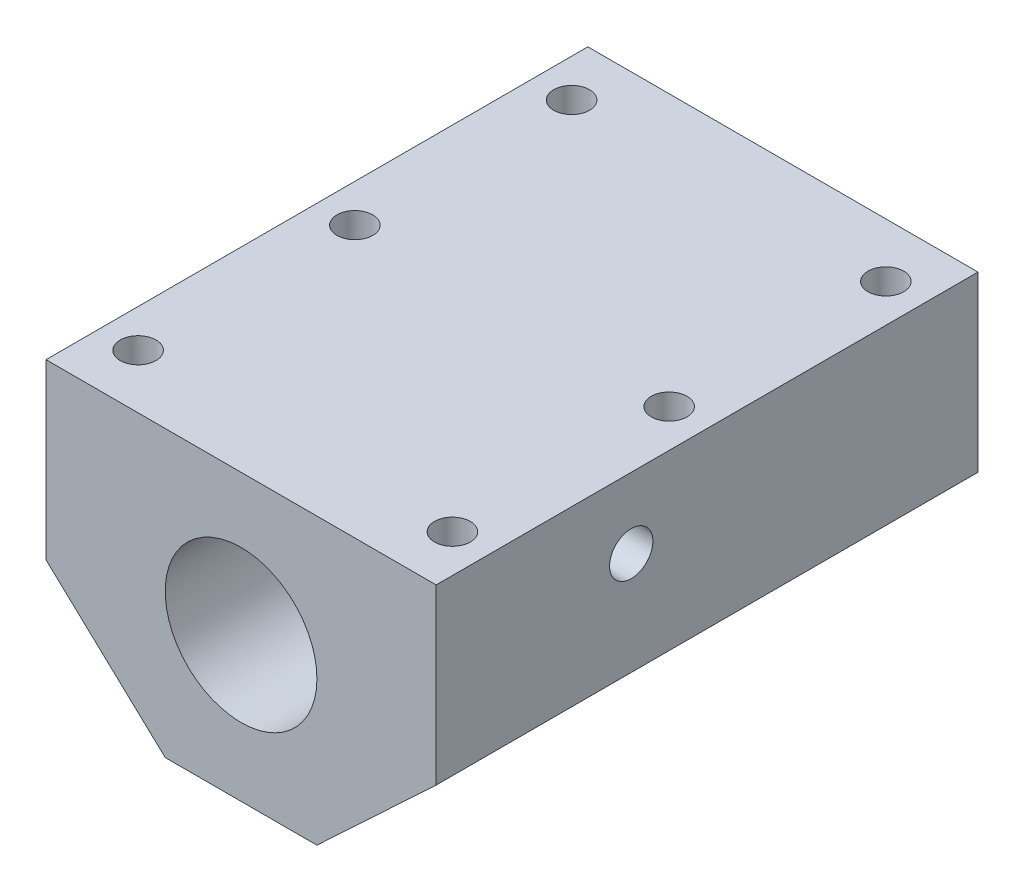
ISO-10303-21;
HEADER;
FILE_DESCRIPTION(('STEP AP214'),'2;1');
FILE_NAME('part.step','',(''),(''),'','','');
FILE_SCHEMA(('AUTOMOTIVE_DESIGN { 1 0 10303 214 1 1 1 1 }'));
ENDSEC;
DATA;
#1=APPLICATION_CONTEXT('core data for automotive mechanical design processes');
#2=APPLICATION_PROTOCOL_DEFINITION('international standard','automotive_design',2000,#1);
#3=PRODUCT_CONTEXT('',#1,'mechanical');
#4=PRODUCT('Part','Part','',(#3));
#5=PRODUCT_RELATED_PRODUCT_CATEGORY('part','',(#4));
#6=PRODUCT_DEFINITION_FORMATION('','',#4);
#7=PRODUCT_DEFINITION_CONTEXT('part definition',#1,'design');
#8=PRODUCT_DEFINITION('design','',#6,#7);
#9=PRODUCT_DEFINITION_SHAPE('','',#8);
#10=(LENGTH_UNIT() NAMED_UNIT(*) SI_UNIT(.MILLI.,.METRE.));
#11=(NAMED_UNIT(*) PLANE_ANGLE_UNIT() SI_UNIT($,.RADIAN.));
#12=(NAMED_UNIT(*) SI_UNIT($,.STERADIAN.) SOLID_ANGLE_UNIT());
#13=UNCERTAINTY_MEASURE_WITH_UNIT(LENGTH_MEASURE(1.E-05),#10,'distance_accuracy_value','');
#14=(GEOMETRIC_REPRESENTATION_CONTEXT(3) GLOBAL_UNCERTAINTY_ASSIGNED_CONTEXT((#13)) GLOBAL_UNIT_ASSIGNED_CONTEXT((#10,
#11,#12)) REPRESENTATION_CONTEXT('',''));
#15=CARTESIAN_POINT('',(0.,0.,0.));
#16=DIRECTION('',(0.,0.,1.));
#17=DIRECTION('',(1.,0.,0.));
#18=AXIS2_PLACEMENT_3D('',#15,#16,#17);
#19=CARTESIAN_POINT('',(18.,6.5,32.));
#20=DIRECTION('',(1.,0.,0.));
#21=DIRECTION('',(0.,0.,-1.));
#22=AXIS2_PLACEMENT_3D('',#19,#20,#21);
#23=CYLINDRICAL_SURFACE('',#22,1.49999999999999);
#24=CARTESIAN_POINT('',(11.6322990396012,5.70347429671537,30.7289583783342));
#25=CARTESIAN_POINT('',(11.7134036836361,5.76023466684744,30.6933373257331));
#26=CARTESIAN_POINT('',(11.7910631729503,5.82362191969331,30.6589809638108));
#27=CARTESIAN_POINT('',(11.9380315876861,5.96355612535442,30.5971052209684));
#28=CARTESIAN_POINT('',(12.0072576664742,6.04021810527068,30.5696512267885));
#29=CARTESIAN_POINT('',(12.1187673995393,6.18528871563461,30.5319699750056));
#30=CARTESIAN_POINT('',(12.1634964221333,6.2511168142296,30.5191699684488));
#31=CARTESIAN_POINT('',(12.2450530551135,6.3883294002631,30.5025753262953));
#32=CARTESIAN_POINT('',(12.2819078507789,6.45969357187347,30.4987492367373));
#33=CARTESIAN_POINT('',(12.3469819115841,6.60687055979773,30.501989272479));
#34=CARTESIAN_POINT('',(12.3751209392542,6.6827174741155,30.5091531864094));
#35=CARTESIAN_POINT('',(12.4215901872934,6.83528396911386,30.535906120018));
#36=CARTESIAN_POINT('',(12.4399194839487,6.91200363128061,30.5554963094123));
#37=CARTESIAN_POINT('',(12.4653966592906,7.05345016340296,30.6040825380621));
#38=CARTESIAN_POINT('',(12.4736454053363,7.11848849159615,30.6316191763977));
#39=CARTESIAN_POINT('',(12.4837722413398,7.24439439245408,30.6958258205429));
#40=CARTESIAN_POINT('',(12.4856503897941,7.30526200341046,30.7324957424847));
#41=CARTESIAN_POINT('',(12.4844058857708,7.42175663923835,30.814463841543));
#42=CARTESIAN_POINT('',(12.4812294618118,7.47732055895023,30.8598502171489));
#43=CARTESIAN_POINT('',(12.471443621996,7.58126096666866,30.9578935862006));
#44=CARTESIAN_POINT('',(12.4648326072427,7.62963409366266,31.0105539575023));
#45=CARTESIAN_POINT('',(12.4490238880115,7.72349710321992,31.1285746456295));
#46=CARTESIAN_POINT('',(12.4396143116599,7.76799118127184,31.1946998858437));
#47=CARTESIAN_POINT('',(12.4209626176597,7.84598795129315,31.3331883323169));
#48=CARTESIAN_POINT('',(12.4117205725327,7.87948598576761,31.4055541655033));
#49=CARTESIAN_POINT('',(12.3949258972307,7.93649816462685,31.5599119373404));
#50=CARTESIAN_POINT('',(12.3875265724169,7.9591998051582,31.6422239921759));
#51=CARTESIAN_POINT('',(12.377147728257,7.99032121449143,31.8097561522014));
#52=CARTESIAN_POINT('',(12.3741657931196,7.99874878988569,31.8949746418068));
#53=CARTESIAN_POINT('',(12.3733997975059,8.0009413690067,32.0617385185441));
#54=CARTESIAN_POINT('',(12.3753857906687,7.9953549906227,32.1432749255414));
#55=CARTESIAN_POINT('',(12.3835994081308,7.97109163219571,32.3041560022858));
#56=CARTESIAN_POINT('',(12.3898279083613,7.9524119488145,32.3835002158999));
#57=CARTESIAN_POINT('',(12.4050168059968,7.90280998810426,32.5372104262713));
#58=CARTESIAN_POINT('',(12.413953647251,7.87199261349013,32.6116128580504));
#59=CARTESIAN_POINT('',(12.4325664615661,7.79891325152446,32.7544990933768));
#60=CARTESIAN_POINT('',(12.4422427935951,7.7566456802889,32.8229799876335));
#61=CARTESIAN_POINT('',(12.4604905193285,7.65897294470026,32.9560100752913));
#62=CARTESIAN_POINT('',(12.4689725125861,7.60297559143576,33.0201392621325));
#63=CARTESIAN_POINT('',(12.4812621583888,7.48065493021329,33.1382128549873));
#64=CARTESIAN_POINT('',(12.4850723090102,7.41433716207166,33.1921626909214));
#65=CARTESIAN_POINT('',(12.48521422948,7.27689603720427,33.2856888083072));
#66=CARTESIAN_POINT('',(12.4819029805714,7.20616688820086,33.3258394622335));
#67=CARTESIAN_POINT('',(12.4665466837888,7.05994013399941,33.3938982156855));
#68=CARTESIAN_POINT('',(12.4545096838222,6.98444698125671,33.4218175583145));
#69=CARTESIAN_POINT('',(12.4226828652265,6.84108124021519,33.4623785602426));
#70=CARTESIAN_POINT('',(12.4039769541899,6.7733620097485,33.4764354436757));
#71=CARTESIAN_POINT('',(12.3590162994368,6.63920312593481,33.4950608148368));
#72=CARTESIAN_POINT('',(12.3327658064749,6.57276277447223,33.4996346336098));
#73=CARTESIAN_POINT('',(12.2734468993663,6.44343586374389,33.5003216437141));
#74=CARTESIAN_POINT('',(12.2404156436589,6.38053222093604,33.4964798869682));
#75=CARTESIAN_POINT('',(12.1682213867142,6.2590612768891,33.481792637965));
#76=CARTESIAN_POINT('',(12.1290408658126,6.20050709224478,33.47092684909));
#77=CARTESIAN_POINT('',(12.0220322324988,6.05732368937905,33.4359986770167));
#78=CARTESIAN_POINT('',(11.9504422419834,5.9764388607774,33.4079541351541));
#79=CARTESIAN_POINT('',(11.8359787509552,5.86595135253858,33.3599972506438));
#80=CARTESIAN_POINT('',(11.7967520584765,5.83100326519826,33.3430798648383));
#81=CARTESIAN_POINT('',(11.7161303639186,5.76463580284508,33.3079143654115));
#82=CARTESIAN_POINT('',(11.6747401921392,5.73320902128709,33.2896691833136));
#83=CARTESIAN_POINT('',(11.6322990396012,5.70347429671538,33.2710416216658));
#84=B_SPLINE_CURVE_WITH_KNOTS('',3,(#24,#25,#26,#27,#28,#29,#30,#31,#32,#33,#34,#35,#36,#37,#38,
#39,#40,#41,#42,#43,#44,#45,#46,#47,#48,#49,#50,#51,#52,#53,#54,#55,#56,#57,#58,#59,#60,#61,#62,
#63,#64,#65,#66,#67,#68,#69,#70,#71,#72,#73,#74,#75,#76,#77,#78,#79,#80,#81,#82,#83),
.UNSPECIFIED.,.F.,.F.,(4,2,2,2,2,2,2,2,2,2,2,2,2,2,2,2,2,2,2,2,2,2,2,2,2,2,2,2,2,4),(0.,
0.316167993426211,0.635226889618817,0.876105829685767,1.11613920884803,1.35832081729634,
1.60052522628254,1.81283466778761,2.0251421598037,2.23972335859051,2.45440454045857,
2.6941472184538,2.93399131145674,3.18979231958475,3.44545338301132,3.68950177320257,
3.93360056623312,4.17563441107128,4.41778650099268,4.67318519042786,4.92844725625143,
5.17121266267515,5.41375444688456,5.62764260861038,5.84141049730445,6.05403679946516,
6.26728026897105,6.5998526709976,6.76530802398738,6.93040856073323),.UNSPECIFIED.);
#85=CARTESIAN_POINT('',(11.6322990396012,5.70347429671537,30.7289583783342));
#86=VERTEX_POINT('',#85);
#87=CARTESIAN_POINT('',(11.6322990396012,5.70347429671537,33.2710416216658));
#88=VERTEX_POINT('',#87);
#89=EDGE_CURVE('E12',#86,#88,#84,.T.);
#90=ORIENTED_EDGE('',*,*,#89,.F.);
#91=CARTESIAN_POINT('',(12.769855635066,6.5,32.));
#92=DIRECTION('',(0.573576436351044,-0.819152044288993,0.));
#93=DIRECTION('',(0.819152044288993,0.573576436351044,0.));
#94=AXIS2_PLACEMENT_3D('',#91,#92,#93);
#95=ELLIPSE('',#94,2.61517019343165,1.49999999999999);
#96=EDGE_CURVE('E52',#88,#86,#95,.T.);
#97=ORIENTED_EDGE('',*,*,#96,.F.);
#98=EDGE_LOOP('',(#90,#97));
#99=FACE_BOUND('',#98,.T.);
#100=CARTESIAN_POINT('',(13.,6.5,32.));
#101=DIRECTION('',(1.,0.,0.));
#102=DIRECTION('',(0.,0.,-1.));
#103=AXIS2_PLACEMENT_3D('',#100,#101,#102);
#104=CIRCLE('',#103,1.49999999999999);
#105=CARTESIAN_POINT('',(13.,6.5,30.5));
#106=VERTEX_POINT('',#105);
#107=EDGE_CURVE('E41',#106,#106,#104,.F.);
#108=ORIENTED_EDGE('',*,*,#107,.F.);
#109=EDGE_LOOP('',(#108));
#110=FACE_BOUND('',#109,.T.);
#111=ADVANCED_FACE('F37',(#99,#110),#23,.F.);
#112=CARTESIAN_POINT('',(0.,-19.8545454545454,0.));
#113=DIRECTION('',(0.,0.,-1.));
#114=DIRECTION('',(-1.,0.,0.));
#115=AXIS2_PLACEMENT_3D('',#112,#113,#114);
#116=PLANE('',#115);
#117=DIRECTION('',(0.819152044288993,0.573576436351044,0.));
#118=VECTOR('',#117,1.);
#119=CARTESIAN_POINT('',(9.33799329419703,8.98008247387135,0.));
#120=LINE('',#119,#118);
#121=CARTESIAN_POINT('',(8.12954059484112,8.13391478421248,0.));
#122=VERTEX_POINT('',#121);
#123=CARTESIAN_POINT('',(9.33799329419703,8.98008247387135,0.));
#124=VERTEX_POINT('',#123);
#125=EDGE_CURVE('E422',#122,#124,#120,.T.);
#126=ORIENTED_EDGE('',*,*,#125,.F.);
#127=CARTESIAN_POINT('',(0.,0.,0.));
#128=DIRECTION('',(0.,0.,-1.));
#129=DIRECTION('',(-1.,0.,0.));
#130=AXIS2_PLACEMENT_3D('',#127,#128,#129);
#131=CIRCLE('',#130,11.5);
#132=CARTESIAN_POINT('',(10.4238463402453,4.8573066070565,0.));
#133=VERTEX_POINT('',#132);
#134=EDGE_CURVE('E220',#122,#133,#131,.F.);
#135=ORIENTED_EDGE('',*,*,#134,.T.);
#136=DIRECTION('',(-0.819152044288993,-0.573576436351044,0.));
#137=VECTOR('',#136,1.);
#138=CARTESIAN_POINT('',(11.6322990396012,5.70347429671537,0.));
#139=LINE('',#138,#137);
#140=CARTESIAN_POINT('',(11.6322990396012,5.70347429671537,0.));
#141=VERTEX_POINT('',#140);
#142=EDGE_CURVE('E59',#141,#133,#139,.T.);
#143=ORIENTED_EDGE('',*,*,#142,.F.);
#144=CARTESIAN_POINT('',(10.4851461668991,7.34177838529336,0.));
#145=DIRECTION('',(0.,0.,-1.));
#146=DIRECTION('',(-1.,0.,0.));
#147=AXIS2_PLACEMENT_3D('',#144,#145,#146);
#148=CIRCLE('',#147,2.);
#149=EDGE_CURVE('E156',#124,#141,#148,.T.);
#150=ORIENTED_EDGE('',*,*,#149,.F.);
#151=EDGE_LOOP('',(#126,#135,#143,#150));
#152=FACE_BOUND('',#151,.T.);
#153=DIRECTION('',(0.729950953166581,-0.683499528874161,0.));
#154=VECTOR('',#153,1.);
#155=CARTESIAN_POINT('',(-18.,-3.00000000000001,0.));
#156=LINE('',#155,#154);
#157=CARTESIAN_POINT('',(-18.,-3.00000000000001,0.));
#158=VERTEX_POINT('',#157);
#159=CARTESIAN_POINT('',(-7.,-13.3,0.));
#160=VERTEX_POINT('',#159);
#161=EDGE_CURVE('E235',#158,#160,#156,.T.);
#162=ORIENTED_EDGE('',*,*,#161,.F.);
#163=DIRECTION('',(0.,-1.,0.));
#164=VECTOR('',#163,1.);
#165=CARTESIAN_POINT('',(-18.,13.,0.));
#166=LINE('',#165,#164);
#167=CARTESIAN_POINT('',(-18.,13.,0.));
#168=VERTEX_POINT('',#167);
#169=EDGE_CURVE('E240',#168,#158,#166,.T.);
#170=ORIENTED_EDGE('',*,*,#169,.F.);
#171=DIRECTION('',(-1.,0.,0.));
#172=VECTOR('',#171,1.);
#173=CARTESIAN_POINT('',(-18.,13.,0.));
#174=LINE('',#173,#172);
#175=CARTESIAN_POINT('',(18.,13.,0.));
#176=VERTEX_POINT('',#175);
#177=EDGE_CURVE('E262',#176,#168,#174,.T.);
#178=ORIENTED_EDGE('',*,*,#177,.F.);
#179=DIRECTION('',(0.,1.,0.));
#180=VECTOR('',#179,1.);
#181=CARTESIAN_POINT('',(18.,13.,0.));
#182=LINE('',#181,#180);
#183=CARTESIAN_POINT('',(18.,-3.00000000000001,0.));
#184=VERTEX_POINT('',#183);
#185=EDGE_CURVE('E259',#184,#176,#182,.T.);
#186=ORIENTED_EDGE('',*,*,#185,.F.);
#187=DIRECTION('',(0.729950953166581,0.683499528874161,0.));
#188=VECTOR('',#187,1.);
#189=CARTESIAN_POINT('',(18.,-3.00000000000001,0.));
#190=LINE('',#189,#188);
#191=CARTESIAN_POINT('',(7.,-13.3,0.));
#192=VERTEX_POINT('',#191);
#193=EDGE_CURVE('E256',#192,#184,#190,.T.);
#194=ORIENTED_EDGE('',*,*,#193,.F.);
#195=DIRECTION('',(1.,0.,0.));
#196=VECTOR('',#195,1.);
#197=CARTESIAN_POINT('',(7.,-13.3,0.));
#198=LINE('',#197,#196);
#199=EDGE_CURVE('E253',#160,#192,#198,.T.);
#200=ORIENTED_EDGE('',*,*,#199,.F.);
#201=EDGE_LOOP('',(#162,#170,#178,#186,#194,#200));
#202=FACE_BOUND('',#201,.T.);
#203=ADVANCED_FACE('F368',(#152,#202),#116,.T.);
#204=CARTESIAN_POINT('',(-18.,-3.00000000000001,50.));
#205=DIRECTION('',(0.683499528874161,0.729950953166581,0.));
#206=DIRECTION('',(-0.729950953166581,0.683499528874161,0.));
#207=AXIS2_PLACEMENT_3D('',#204,#205,#206);
#208=PLANE('',#207);
#209=DIRECTION('',(0.,0.,-1.));
#210=VECTOR('',#209,1.);
#211=CARTESIAN_POINT('',(-18.,-3.00000000000001,50.));
#212=LINE('',#211,#210);
#213=CARTESIAN_POINT('',(-18.,-3.00000000000001,50.));
#214=VERTEX_POINT('',#213);
#215=EDGE_CURVE('E250',#214,#158,#212,.T.);
#216=ORIENTED_EDGE('',*,*,#215,.T.);
#217=ORIENTED_EDGE('',*,*,#161,.T.);
#218=DIRECTION('',(0.,0.,-1.));
#219=VECTOR('',#218,1.);
#220=CARTESIAN_POINT('',(-7.,-13.3,50.));
#221=LINE('',#220,#219);
#222=CARTESIAN_POINT('',(-7.,-13.3,50.));
#223=VERTEX_POINT('',#222);
#224=EDGE_CURVE('E276',#223,#160,#221,.T.);
#225=ORIENTED_EDGE('',*,*,#224,.F.);
#226=DIRECTION('',(0.729950953166581,-0.683499528874161,0.));
#227=VECTOR('',#226,1.);
#228=CARTESIAN_POINT('',(-18.,-3.00000000000001,50.));
#229=LINE('',#228,#227);
#230=EDGE_CURVE('E236',#214,#223,#229,.T.);
#231=ORIENTED_EDGE('',*,*,#230,.F.);
#232=EDGE_LOOP('',(#216,#217,#225,#231));
#233=FACE_BOUND('',#232,.T.);
#234=ADVANCED_FACE('F371',(#233),#208,.F.);
#235=CARTESIAN_POINT('',(7.,-13.3,50.));
#236=DIRECTION('',(0.,1.,0.));
#237=DIRECTION('',(0.,0.,1.));
#238=AXIS2_PLACEMENT_3D('',#235,#236,#237);
#239=PLANE('',#238);
#240=ORIENTED_EDGE('',*,*,#224,.T.);
#241=ORIENTED_EDGE('',*,*,#199,.T.);
#242=DIRECTION('',(0.,0.,-1.));
#243=VECTOR('',#242,1.);
#244=CARTESIAN_POINT('',(7.,-13.3,50.));
#245=LINE('',#244,#243);
#246=CARTESIAN_POINT('',(7.,-13.3,50.));
#247=VERTEX_POINT('',#246);
#248=EDGE_CURVE('E274',#247,#192,#245,.T.);
#249=ORIENTED_EDGE('',*,*,#248,.F.);
#250=DIRECTION('',(1.,0.,0.));
#251=VECTOR('',#250,1.);
#252=CARTESIAN_POINT('',(7.,-13.3,50.));
#253=LINE('',#252,#251);
#254=EDGE_CURVE('E239',#223,#247,#253,.T.);
#255=ORIENTED_EDGE('',*,*,#254,.F.);
#256=EDGE_LOOP('',(#240,#241,#249,#255));
#257=FACE_BOUND('',#256,.T.);
#258=ADVANCED_FACE('F387',(#257),#239,.F.);
#259=CARTESIAN_POINT('',(18.,-3.00000000000001,50.));
#260=DIRECTION('',(-0.683499528874161,0.729950953166581,0.));
#261=DIRECTION('',(-0.729950953166581,-0.683499528874161,0.));
#262=AXIS2_PLACEMENT_3D('',#259,#260,#261);
#263=PLANE('',#262);
#264=ORIENTED_EDGE('',*,*,#248,.T.);
#265=ORIENTED_EDGE('',*,*,#193,.T.);
#266=DIRECTION('',(0.,0.,-1.));
#267=VECTOR('',#266,1.);
#268=CARTESIAN_POINT('',(18.,-3.00000000000001,50.));
#269=LINE('',#268,#267);
#270=CARTESIAN_POINT('',(18.,-3.00000000000001,50.));
#271=VERTEX_POINT('',#270);
#272=EDGE_CURVE('E272',#271,#184,#269,.T.);
#273=ORIENTED_EDGE('',*,*,#272,.F.);
#274=DIRECTION('',(0.729950953166581,0.683499528874161,0.));
#275=VECTOR('',#274,1.);
#276=CARTESIAN_POINT('',(18.,-3.00000000000001,50.));
#277=LINE('',#276,#275);
#278=EDGE_CURVE('E242',#247,#271,#277,.T.);
#279=ORIENTED_EDGE('',*,*,#278,.F.);
#280=EDGE_LOOP('',(#264,#265,#273,#279));
#281=FACE_BOUND('',#280,.T.);
#282=ADVANCED_FACE('F383',(#281),#263,.F.);
#283=CARTESIAN_POINT('',(18.,13.,50.));
#284=DIRECTION('',(-1.,0.,0.));
#285=DIRECTION('',(0.,0.,1.));
#286=AXIS2_PLACEMENT_3D('',#283,#284,#285);
#287=PLANE('',#286);
#288=CARTESIAN_POINT('',(18.,6.5,32.));
#289=DIRECTION('',(1.,0.,0.));
#290=DIRECTION('',(0.,0.,-1.));
#291=AXIS2_PLACEMENT_3D('',#288,#289,#290);
#292=CIRCLE('',#291,2.);
#293=CARTESIAN_POINT('',(18.,6.5,30.));
#294=VERTEX_POINT('',#293);
#295=EDGE_CURVE('E429',#294,#294,#292,.T.);
#296=ORIENTED_EDGE('',*,*,#295,.F.);
#297=EDGE_LOOP('',(#296));
#298=FACE_BOUND('',#297,.T.);
#299=ORIENTED_EDGE('',*,*,#272,.T.);
#300=ORIENTED_EDGE('',*,*,#185,.T.);
#301=DIRECTION('',(0.,0.,-1.));
#302=VECTOR('',#301,1.);
#303=CARTESIAN_POINT('',(18.,13.,50.));
#304=LINE('',#303,#302);
#305=CARTESIAN_POINT('',(18.,13.,50.));
#306=VERTEX_POINT('',#305);
#307=EDGE_CURVE('E270',#306,#176,#304,.T.);
#308=ORIENTED_EDGE('',*,*,#307,.F.);
#309=DIRECTION('',(0.,1.,0.));
#310=VECTOR('',#309,1.);
#311=CARTESIAN_POINT('',(18.,13.,50.));
#312=LINE('',#311,#310);
#313=EDGE_CURVE('E244',#271,#306,#312,.T.);
#314=ORIENTED_EDGE('',*,*,#313,.F.);
#315=EDGE_LOOP('',(#299,#300,#308,#314));
#316=FACE_BOUND('',#315,.T.);
#317=ADVANCED_FACE('F379',(#298,#316),#287,.F.);
#318=CARTESIAN_POINT('',(-18.,13.,50.));
#319=DIRECTION('',(0.,-1.,0.));
#320=DIRECTION('',(0.,0.,-1.));
#321=AXIS2_PLACEMENT_3D('',#318,#319,#320);
#322=PLANE('',#321);
#323=CARTESIAN_POINT('',(14.5,13.,5.));
#324=DIRECTION('',(0.,1.,0.));
#325=DIRECTION('',(0.,0.,1.));
#326=AXIS2_PLACEMENT_3D('',#323,#324,#325);
#327=CIRCLE('',#326,1.65);
#328=CARTESIAN_POINT('',(14.5,13.,6.65));
#329=VERTEX_POINT('',#328);
#330=EDGE_CURVE('E181',#329,#329,#327,.T.);
#331=ORIENTED_EDGE('',*,*,#330,.F.);
#332=EDGE_LOOP('',(#331));
#333=FACE_BOUND('',#332,.T.);
#334=CARTESIAN_POINT('',(14.5,13.,25.));
#335=DIRECTION('',(0.,1.,0.));
#336=DIRECTION('',(0.,0.,1.));
#337=AXIS2_PLACEMENT_3D('',#334,#335,#336);
#338=CIRCLE('',#337,1.65);
#339=CARTESIAN_POINT('',(14.5,13.,26.65));
#340=VERTEX_POINT('',#339);
#341=EDGE_CURVE('E187',#340,#340,#338,.T.);
#342=ORIENTED_EDGE('',*,*,#341,.F.);
#343=EDGE_LOOP('',(#342));
#344=FACE_BOUND('',#343,.T.);
#345=CARTESIAN_POINT('',(14.5,13.,45.));
#346=DIRECTION('',(0.,1.,0.));
#347=DIRECTION('',(0.,0.,1.));
#348=AXIS2_PLACEMENT_3D('',#345,#346,#347);
#349=CIRCLE('',#348,1.65);
#350=CARTESIAN_POINT('',(14.5,13.,46.65));
#351=VERTEX_POINT('',#350);
#352=EDGE_CURVE('E193',#351,#351,#349,.T.);
#353=ORIENTED_EDGE('',*,*,#352,.F.);
#354=EDGE_LOOP('',(#353));
#355=FACE_BOUND('',#354,.T.);
#356=CARTESIAN_POINT('',(-14.5,13.,5.));
#357=DIRECTION('',(0.,1.,0.));
#358=DIRECTION('',(0.,0.,1.));
#359=AXIS2_PLACEMENT_3D('',#356,#357,#358);
#360=CIRCLE('',#359,1.65);
#361=CARTESIAN_POINT('',(-14.5,13.,6.65));
#362=VERTEX_POINT('',#361);
#363=EDGE_CURVE('E199',#362,#362,#360,.T.);
#364=ORIENTED_EDGE('',*,*,#363,.F.);
#365=EDGE_LOOP('',(#364));
#366=FACE_BOUND('',#365,.T.);
#367=CARTESIAN_POINT('',(-14.5,13.,25.));
#368=DIRECTION('',(0.,1.,0.));
#369=DIRECTION('',(0.,0.,1.));
#370=AXIS2_PLACEMENT_3D('',#367,#368,#369);
#371=CIRCLE('',#370,1.65);
#372=CARTESIAN_POINT('',(-14.5,13.,26.65));
#373=VERTEX_POINT('',#372);
#374=EDGE_CURVE('E205',#373,#373,#371,.T.);
#375=ORIENTED_EDGE('',*,*,#374,.F.);
#376=EDGE_LOOP('',(#375));
#377=FACE_BOUND('',#376,.T.);
#378=CARTESIAN_POINT('',(-14.5,13.,45.));
#379=DIRECTION('',(0.,1.,0.));
#380=DIRECTION('',(0.,0.,1.));
#381=AXIS2_PLACEMENT_3D('',#378,#379,#380);
#382=CIRCLE('',#381,1.65);
#383=CARTESIAN_POINT('',(-14.5,13.,46.65));
#384=VERTEX_POINT('',#383);
#385=EDGE_CURVE('E211',#384,#384,#382,.T.);
#386=ORIENTED_EDGE('',*,*,#385,.F.);
#387=EDGE_LOOP('',(#386));
#388=FACE_BOUND('',#387,.T.);
#389=ORIENTED_EDGE('',*,*,#307,.T.);
#390=ORIENTED_EDGE('',*,*,#177,.T.);
#391=DIRECTION('',(0.,0.,-1.));
#392=VECTOR('',#391,1.);
#393=CARTESIAN_POINT('',(-18.,13.,50.));
#394=LINE('',#393,#392);
#395=CARTESIAN_POINT('',(-18.,13.,50.));
#396=VERTEX_POINT('',#395);
#397=EDGE_CURVE('E268',#396,#168,#394,.T.);
#398=ORIENTED_EDGE('',*,*,#397,.F.);
#399=DIRECTION('',(-1.,0.,0.));
#400=VECTOR('',#399,1.);
#401=CARTESIAN_POINT('',(-18.,13.,50.));
#402=LINE('',#401,#400);
#403=EDGE_CURVE('E246',#306,#396,#402,.T.);
#404=ORIENTED_EDGE('',*,*,#403,.F.);
#405=EDGE_LOOP('',(#389,#390,#398,#404));
#406=FACE_BOUND('',#405,.T.);
#407=ADVANCED_FACE('F375',(#333,#344,#355,#366,#377,#388,#406),#322,.F.);
#408=CARTESIAN_POINT('',(-18.,13.,50.));
#409=DIRECTION('',(1.,0.,0.));
#410=DIRECTION('',(0.,0.,-1.));
#411=AXIS2_PLACEMENT_3D('',#408,#409,#410);
#412=PLANE('',#411);
#413=ORIENTED_EDGE('',*,*,#397,.T.);
#414=ORIENTED_EDGE('',*,*,#169,.T.);
#415=ORIENTED_EDGE('',*,*,#215,.F.);
#416=DIRECTION('',(0.,-1.,0.));
#417=VECTOR('',#416,1.);
#418=CARTESIAN_POINT('',(-18.,13.,50.));
#419=LINE('',#418,#417);
#420=EDGE_CURVE('E248',#396,#214,#419,.T.);
#421=ORIENTED_EDGE('',*,*,#420,.F.);
#422=EDGE_LOOP('',(#413,#414,#415,#421));
#423=FACE_BOUND('',#422,.T.);
#424=ADVANCED_FACE('F366',(#423),#412,.F.);
#425=CARTESIAN_POINT('',(0.,-19.8545454545454,50.));
#426=DIRECTION('',(0.,0.,-1.));
#427=DIRECTION('',(-1.,0.,0.));
#428=AXIS2_PLACEMENT_3D('',#425,#426,#427);
#429=PLANE('',#428);
#430=CARTESIAN_POINT('',(0.,0.,50.));
#431=DIRECTION('',(0.,0.,1.));
#432=DIRECTION('',(1.,0.,0.));
#433=AXIS2_PLACEMENT_3D('',#430,#431,#432);
#434=CIRCLE('',#433,7.);
#435=CARTESIAN_POINT('',(7.,0.,50.));
#436=VERTEX_POINT('',#435);
#437=EDGE_CURVE('E232',#436,#436,#434,.T.);
#438=ORIENTED_EDGE('',*,*,#437,.F.);
#439=EDGE_LOOP('',(#438));
#440=FACE_BOUND('',#439,.T.);
#441=ORIENTED_EDGE('',*,*,#230,.T.);
#442=ORIENTED_EDGE('',*,*,#254,.T.);
#443=ORIENTED_EDGE('',*,*,#278,.T.);
#444=ORIENTED_EDGE('',*,*,#313,.T.);
#445=ORIENTED_EDGE('',*,*,#403,.T.);
#446=ORIENTED_EDGE('',*,*,#420,.T.);
#447=EDGE_LOOP('',(#441,#442,#443,#444,#445,#446));
#448=FACE_BOUND('',#447,.T.);
#449=ADVANCED_FACE('F362',(#440,#448),#429,.F.);
#450=CARTESIAN_POINT('',(0.,0.,40.));
#451=DIRECTION('',(0.,0.,1.));
#452=DIRECTION('',(1.,0.,0.));
#453=AXIS2_PLACEMENT_3D('',#450,#451,#452);
#454=CYLINDRICAL_SURFACE('',#453,7.);
#455=CARTESIAN_POINT('',(0.,0.,40.));
#456=DIRECTION('',(0.,0.,1.));
#457=DIRECTION('',(1.,0.,0.));
#458=AXIS2_PLACEMENT_3D('',#455,#456,#457);
#459=CIRCLE('',#458,7.);
#460=CARTESIAN_POINT('',(7.,0.,40.));
#461=VERTEX_POINT('',#460);
#462=EDGE_CURVE('E229',#461,#461,#459,.F.);
#463=ORIENTED_EDGE('',*,*,#462,.T.);
#464=EDGE_LOOP('',(#463));
#465=FACE_BOUND('',#464,.T.);
#466=ORIENTED_EDGE('',*,*,#437,.T.);
#467=EDGE_LOOP('',(#466));
#468=FACE_BOUND('',#467,.T.);
#469=ADVANCED_FACE('F355',(#465,#468),#454,.F.);
#470=CARTESIAN_POINT('',(0.,0.,40.));
#471=DIRECTION('',(0.,0.,1.));
#472=DIRECTION('',(1.,0.,0.));
#473=AXIS2_PLACEMENT_3D('',#470,#471,#472);
#474=PLANE('',#473);
#475=CARTESIAN_POINT('',(0.,0.,40.));
#476=DIRECTION('',(0.,0.,1.));
#477=DIRECTION('',(1.,0.,0.));
#478=AXIS2_PLACEMENT_3D('',#475,#476,#477);
#479=CIRCLE('',#478,11.);
#480=CARTESIAN_POINT('',(11.,0.,40.));
#481=VERTEX_POINT('',#480);
#482=EDGE_CURVE('E226',#481,#481,#479,.T.);
#483=ORIENTED_EDGE('',*,*,#482,.F.);
#484=EDGE_LOOP('',(#483));
#485=FACE_BOUND('',#484,.T.);
#486=ORIENTED_EDGE('',*,*,#462,.F.);
#487=EDGE_LOOP('',(#486));
#488=FACE_BOUND('',#487,.T.);
#489=ADVANCED_FACE('F352',(#485,#488),#474,.F.);
#490=CARTESIAN_POINT('',(0.,0.,13.));
#491=DIRECTION('',(0.,0.,1.));
#492=DIRECTION('',(1.,0.,0.));
#493=AXIS2_PLACEMENT_3D('',#490,#491,#492);
#494=CYLINDRICAL_SURFACE('',#493,11.);
#495=CARTESIAN_POINT('',(0.,0.,13.));
#496=DIRECTION('',(0.,0.,1.));
#497=DIRECTION('',(1.,0.,0.));
#498=AXIS2_PLACEMENT_3D('',#495,#496,#497);
#499=CIRCLE('',#498,11.);
#500=CARTESIAN_POINT('',(7.71333122155325,7.84248184356278,13.));
#501=VERTEX_POINT('',#500);
#502=CARTESIAN_POINT('',(10.0076369669574,4.5658736664068,13.));
#503=VERTEX_POINT('',#502);
#504=EDGE_CURVE('E223',#501,#503,#499,.T.);
#505=ORIENTED_EDGE('',*,*,#504,.F.);
#506=DIRECTION('',(0.,0.,1.));
#507=VECTOR('',#506,1.);
#508=CARTESIAN_POINT('',(7.71333122155325,7.84248184356278,13.));
#509=LINE('',#508,#507);
#510=CARTESIAN_POINT('',(7.71333122155325,7.84248184356278,34.));
#511=VERTEX_POINT('',#510);
#512=EDGE_CURVE('E178',#501,#511,#509,.T.);
#513=ORIENTED_EDGE('',*,*,#512,.T.);
#514=CARTESIAN_POINT('',(0.,0.,34.));
#515=DIRECTION('',(0.,0.,-1.));
#516=DIRECTION('',(-1.,0.,0.));
#517=AXIS2_PLACEMENT_3D('',#514,#515,#516);
#518=CIRCLE('',#517,11.);
#519=CARTESIAN_POINT('',(10.0076369669574,4.5658736664068,34.));
#520=VERTEX_POINT('',#519);
#521=EDGE_CURVE('E46',#520,#511,#518,.F.);
#522=ORIENTED_EDGE('',*,*,#521,.F.);
#523=DIRECTION('',(0.,0.,1.));
#524=VECTOR('',#523,1.);
#525=CARTESIAN_POINT('',(10.0076369669574,4.5658736664068,13.));
#526=LINE('',#525,#524);
#527=EDGE_CURVE('E172',#520,#503,#526,.F.);
#528=ORIENTED_EDGE('',*,*,#527,.T.);
#529=EDGE_LOOP('',(#505,#513,#522,#528));
#530=FACE_BOUND('',#529,.T.);
#531=ORIENTED_EDGE('',*,*,#482,.T.);
#532=EDGE_LOOP('',(#531));
#533=FACE_BOUND('',#532,.T.);
#534=ADVANCED_FACE('F347',(#530,#533),#494,.F.);
#535=CARTESIAN_POINT('',(11.5,0.,13.));
#536=DIRECTION('',(0.,0.,1.));
#537=DIRECTION('',(1.,0.,0.));
#538=AXIS2_PLACEMENT_3D('',#535,#536,#537);
#539=PLANE('',#538);
#540=CARTESIAN_POINT('',(0.,0.,13.));
#541=DIRECTION('',(0.,0.,1.));
#542=DIRECTION('',(1.,0.,0.));
#543=AXIS2_PLACEMENT_3D('',#540,#541,#542);
#544=CIRCLE('',#543,11.5);
#545=CARTESIAN_POINT('',(8.12954059484112,8.13391478421248,13.));
#546=VERTEX_POINT('',#545);
#547=CARTESIAN_POINT('',(10.4238463402453,4.8573066070565,13.));
#548=VERTEX_POINT('',#547);
#549=EDGE_CURVE('E217',#546,#548,#544,.T.);
#550=ORIENTED_EDGE('',*,*,#549,.F.);
#551=DIRECTION('',(-0.819152044288993,-0.573576436351044,0.));
#552=VECTOR('',#551,1.);
#553=CARTESIAN_POINT('',(6.56946295142053,7.04153665809695,13.));
#554=LINE('',#553,#552);
#555=EDGE_CURVE('E175',#546,#501,#554,.T.);
#556=ORIENTED_EDGE('',*,*,#555,.T.);
#557=ORIENTED_EDGE('',*,*,#504,.T.);
#558=DIRECTION('',(0.819152044288993,0.573576436351044,0.));
#559=VECTOR('',#558,1.);
#560=CARTESIAN_POINT('',(8.86376869682471,3.76492848094097,13.));
#561=LINE('',#560,#559);
#562=EDGE_CURVE('E169',#503,#548,#561,.T.);
#563=ORIENTED_EDGE('',*,*,#562,.T.);
#564=EDGE_LOOP('',(#550,#556,#557,#563));
#565=FACE_BOUND('',#564,.T.);
#566=ADVANCED_FACE('F344',(#565),#539,.F.);
#567=CARTESIAN_POINT('',(0.,0.,13.));
#568=DIRECTION('',(0.,0.,1.));
#569=DIRECTION('',(1.,0.,0.));
#570=AXIS2_PLACEMENT_3D('',#567,#568,#569);
#571=CYLINDRICAL_SURFACE('',#570,11.5);
#572=ORIENTED_EDGE('',*,*,#134,.F.);
#573=DIRECTION('',(0.,0.,1.));
#574=VECTOR('',#573,1.);
#575=CARTESIAN_POINT('',(8.12954059484112,8.13391478421248,13.));
#576=LINE('',#575,#574);
#577=EDGE_CURVE('E280',#122,#546,#576,.T.);
#578=ORIENTED_EDGE('',*,*,#577,.T.);
#579=ORIENTED_EDGE('',*,*,#549,.T.);
#580=DIRECTION('',(0.,0.,1.));
#581=VECTOR('',#580,1.);
#582=CARTESIAN_POINT('',(10.4238463402453,4.8573066070565,13.));
#583=LINE('',#582,#581);
#584=EDGE_CURVE('E278',#548,#133,#583,.F.);
#585=ORIENTED_EDGE('',*,*,#584,.T.);
#586=EDGE_LOOP('',(#572,#578,#579,#585));
#587=FACE_BOUND('',#586,.T.);
#588=ADVANCED_FACE('F342',(#587),#571,.F.);
#589=CARTESIAN_POINT('',(-14.5,1.5,45.));
#590=DIRECTION('',(0.,1.,0.));
#591=DIRECTION('',(0.,0.,1.));
#592=AXIS2_PLACEMENT_3D('',#589,#590,#591);
#593=CONICAL_SURFACE('',#592,1.65,1.02974425867665);
#594=CARTESIAN_POINT('',(-14.5,0.508579978604522,45.));
#595=VERTEX_POINT('',#594);
#596=VERTEX_LOOP('',#595);
#597=FACE_BOUND('',#596,.T.);
#598=CARTESIAN_POINT('',(-14.5,1.5,45.));
#599=DIRECTION('',(0.,1.,0.));
#600=DIRECTION('',(0.,0.,1.));
#601=AXIS2_PLACEMENT_3D('',#598,#599,#600);
#602=CIRCLE('',#601,1.65);
#603=CARTESIAN_POINT('',(-14.5,1.5,46.65));
#604=VERTEX_POINT('',#603);
#605=EDGE_CURVE('E214',#604,#604,#602,.T.);
#606=ORIENTED_EDGE('',*,*,#605,.T.);
#607=EDGE_LOOP('',(#606));
#608=FACE_BOUND('',#607,.T.);
#609=ADVANCED_FACE('F338',(#597,#608),#593,.F.);
#610=CARTESIAN_POINT('',(-14.5,13.,45.));
#611=DIRECTION('',(0.,1.,0.));
#612=DIRECTION('',(0.,0.,1.));
#613=AXIS2_PLACEMENT_3D('',#610,#611,#612);
#614=CYLINDRICAL_SURFACE('',#613,1.65);
#615=ORIENTED_EDGE('',*,*,#605,.F.);
#616=EDGE_LOOP('',(#615));
#617=FACE_BOUND('',#616,.T.);
#618=ORIENTED_EDGE('',*,*,#385,.T.);
#619=EDGE_LOOP('',(#618));
#620=FACE_BOUND('',#619,.T.);
#621=ADVANCED_FACE('F334',(#617,#620),#614,.F.);
#622=CARTESIAN_POINT('',(-14.5,1.5,25.));
#623=DIRECTION('',(0.,1.,0.));
#624=DIRECTION('',(0.,0.,1.));
#625=AXIS2_PLACEMENT_3D('',#622,#623,#624);
#626=CONICAL_SURFACE('',#625,1.65,1.02974425867665);
#627=CARTESIAN_POINT('',(-14.5,0.508579978604522,25.));
#628=VERTEX_POINT('',#627);
#629=VERTEX_LOOP('',#628);
#630=FACE_BOUND('',#629,.T.);
#631=CARTESIAN_POINT('',(-14.5,1.5,25.));
#632=DIRECTION('',(0.,1.,0.));
#633=DIRECTION('',(0.,0.,1.));
#634=AXIS2_PLACEMENT_3D('',#631,#632,#633);
#635=CIRCLE('',#634,1.65);
#636=CARTESIAN_POINT('',(-14.5,1.5,26.65));
#637=VERTEX_POINT('',#636);
#638=EDGE_CURVE('E208',#637,#637,#635,.T.);
#639=ORIENTED_EDGE('',*,*,#638,.T.);
#640=EDGE_LOOP('',(#639));
#641=FACE_BOUND('',#640,.T.);
#642=ADVANCED_FACE('F330',(#630,#641),#626,.F.);
#643=CARTESIAN_POINT('',(-14.5,13.,25.));
#644=DIRECTION('',(0.,1.,0.));
#645=DIRECTION('',(0.,0.,1.));
#646=AXIS2_PLACEMENT_3D('',#643,#644,#645);
#647=CYLINDRICAL_SURFACE('',#646,1.65);
#648=ORIENTED_EDGE('',*,*,#638,.F.);
#649=EDGE_LOOP('',(#648));
#650=FACE_BOUND('',#649,.T.);
#651=ORIENTED_EDGE('',*,*,#374,.T.);
#652=EDGE_LOOP('',(#651));
#653=FACE_BOUND('',#652,.T.);
#654=ADVANCED_FACE('F326',(#650,#653),#647,.F.);
#655=CARTESIAN_POINT('',(-14.5,1.5,5.));
#656=DIRECTION('',(0.,1.,0.));
#657=DIRECTION('',(0.,0.,1.));
#658=AXIS2_PLACEMENT_3D('',#655,#656,#657);
#659=CONICAL_SURFACE('',#658,1.65,1.02974425867665);
#660=CARTESIAN_POINT('',(-14.5,0.508579978604522,5.));
#661=VERTEX_POINT('',#660);
#662=VERTEX_LOOP('',#661);
#663=FACE_BOUND('',#662,.T.);
#664=CARTESIAN_POINT('',(-14.5,1.5,5.));
#665=DIRECTION('',(0.,1.,0.));
#666=DIRECTION('',(0.,0.,1.));
#667=AXIS2_PLACEMENT_3D('',#664,#665,#666);
#668=CIRCLE('',#667,1.65);
#669=CARTESIAN_POINT('',(-14.5,1.5,6.65));
#670=VERTEX_POINT('',#669);
#671=EDGE_CURVE('E202',#670,#670,#668,.T.);
#672=ORIENTED_EDGE('',*,*,#671,.T.);
#673=EDGE_LOOP('',(#672));
#674=FACE_BOUND('',#673,.T.);
#675=ADVANCED_FACE('F322',(#663,#674),#659,.F.);
#676=CARTESIAN_POINT('',(-14.5,13.,5.));
#677=DIRECTION('',(0.,1.,0.));
#678=DIRECTION('',(0.,0.,1.));
#679=AXIS2_PLACEMENT_3D('',#676,#677,#678);
#680=CYLINDRICAL_SURFACE('',#679,1.65);
#681=ORIENTED_EDGE('',*,*,#671,.F.);
#682=EDGE_LOOP('',(#681));
#683=FACE_BOUND('',#682,.T.);
#684=ORIENTED_EDGE('',*,*,#363,.T.);
#685=EDGE_LOOP('',(#684));
#686=FACE_BOUND('',#685,.T.);
#687=ADVANCED_FACE('F318',(#683,#686),#680,.F.);
#688=CARTESIAN_POINT('',(14.5,1.5,45.));
#689=DIRECTION('',(0.,1.,0.));
#690=DIRECTION('',(0.,0.,1.));
#691=AXIS2_PLACEMENT_3D('',#688,#689,#690);
#692=CONICAL_SURFACE('',#691,1.65,1.02974425867665);
#693=CARTESIAN_POINT('',(14.5,0.508579978604522,45.));
#694=VERTEX_POINT('',#693);
#695=VERTEX_LOOP('',#694);
#696=FACE_BOUND('',#695,.T.);
#697=CARTESIAN_POINT('',(14.5,1.5,45.));
#698=DIRECTION('',(0.,1.,0.));
#699=DIRECTION('',(0.,0.,1.));
#700=AXIS2_PLACEMENT_3D('',#697,#698,#699);
#701=CIRCLE('',#700,1.65);
#702=CARTESIAN_POINT('',(14.5,1.5,46.65));
#703=VERTEX_POINT('',#702);
#704=EDGE_CURVE('E196',#703,#703,#701,.T.);
#705=ORIENTED_EDGE('',*,*,#704,.T.);
#706=EDGE_LOOP('',(#705));
#707=FACE_BOUND('',#706,.T.);
#708=ADVANCED_FACE('F314',(#696,#707),#692,.F.);
#709=CARTESIAN_POINT('',(14.5,13.,45.));
#710=DIRECTION('',(0.,1.,0.));
#711=DIRECTION('',(0.,0.,1.));
#712=AXIS2_PLACEMENT_3D('',#709,#710,#711);
#713=CYLINDRICAL_SURFACE('',#712,1.65);
#714=ORIENTED_EDGE('',*,*,#704,.F.);
#715=EDGE_LOOP('',(#714));
#716=FACE_BOUND('',#715,.T.);
#717=ORIENTED_EDGE('',*,*,#352,.T.);
#718=EDGE_LOOP('',(#717));
#719=FACE_BOUND('',#718,.T.);
#720=ADVANCED_FACE('F310',(#716,#719),#713,.F.);
#721=CARTESIAN_POINT('',(14.5,1.5,25.));
#722=DIRECTION('',(0.,1.,0.));
#723=DIRECTION('',(0.,0.,1.));
#724=AXIS2_PLACEMENT_3D('',#721,#722,#723);
#725=CONICAL_SURFACE('',#724,1.65,1.02974425867665);
#726=CARTESIAN_POINT('',(14.5,0.508579978604522,25.));
#727=VERTEX_POINT('',#726);
#728=VERTEX_LOOP('',#727);
#729=FACE_BOUND('',#728,.T.);
#730=CARTESIAN_POINT('',(14.5,1.5,25.));
#731=DIRECTION('',(0.,1.,0.));
#732=DIRECTION('',(0.,0.,1.));
#733=AXIS2_PLACEMENT_3D('',#730,#731,#732);
#734=CIRCLE('',#733,1.65);
#735=CARTESIAN_POINT('',(14.5,1.5,26.65));
#736=VERTEX_POINT('',#735);
#737=EDGE_CURVE('E190',#736,#736,#734,.T.);
#738=ORIENTED_EDGE('',*,*,#737,.T.);
#739=EDGE_LOOP('',(#738));
#740=FACE_BOUND('',#739,.T.);
#741=ADVANCED_FACE('F306',(#729,#740),#725,.F.);
#742=CARTESIAN_POINT('',(14.5,13.,25.));
#743=DIRECTION('',(0.,1.,0.));
#744=DIRECTION('',(0.,0.,1.));
#745=AXIS2_PLACEMENT_3D('',#742,#743,#744);
#746=CYLINDRICAL_SURFACE('',#745,1.65);
#747=ORIENTED_EDGE('',*,*,#737,.F.);
#748=EDGE_LOOP('',(#747));
#749=FACE_BOUND('',#748,.T.);
#750=ORIENTED_EDGE('',*,*,#341,.T.);
#751=EDGE_LOOP('',(#750));
#752=FACE_BOUND('',#751,.T.);
#753=ADVANCED_FACE('F302',(#749,#752),#746,.F.);
#754=CARTESIAN_POINT('',(14.5,1.5,5.));
#755=DIRECTION('',(0.,1.,0.));
#756=DIRECTION('',(0.,0.,1.));
#757=AXIS2_PLACEMENT_3D('',#754,#755,#756);
#758=CONICAL_SURFACE('',#757,1.65,1.02974425867665);
#759=CARTESIAN_POINT('',(14.5,0.508579978604522,5.));
#760=VERTEX_POINT('',#759);
#761=VERTEX_LOOP('',#760);
#762=FACE_BOUND('',#761,.T.);
#763=CARTESIAN_POINT('',(14.5,1.5,5.));
#764=DIRECTION('',(0.,1.,0.));
#765=DIRECTION('',(0.,0.,1.));
#766=AXIS2_PLACEMENT_3D('',#763,#764,#765);
#767=CIRCLE('',#766,1.65);
#768=CARTESIAN_POINT('',(14.5,1.5,6.65));
#769=VERTEX_POINT('',#768);
#770=EDGE_CURVE('E184',#769,#769,#767,.T.);
#771=ORIENTED_EDGE('',*,*,#770,.T.);
#772=EDGE_LOOP('',(#771));
#773=FACE_BOUND('',#772,.T.);
#774=ADVANCED_FACE('F298',(#762,#773),#758,.F.);
#775=CARTESIAN_POINT('',(14.5,13.,5.));
#776=DIRECTION('',(0.,1.,0.));
#777=DIRECTION('',(0.,0.,1.));
#778=AXIS2_PLACEMENT_3D('',#775,#776,#777);
#779=CYLINDRICAL_SURFACE('',#778,1.65);
#780=ORIENTED_EDGE('',*,*,#770,.F.);
#781=EDGE_LOOP('',(#780));
#782=FACE_BOUND('',#781,.T.);
#783=ORIENTED_EDGE('',*,*,#330,.T.);
#784=EDGE_LOOP('',(#783));
#785=FACE_BOUND('',#784,.T.);
#786=ADVANCED_FACE('F294',(#782,#785),#779,.F.);
#787=CARTESIAN_POINT('',(10.4851461668991,7.34177838529336,34.));
#788=DIRECTION('',(0.,0.,-1.));
#789=DIRECTION('',(-1.,0.,0.));
#790=AXIS2_PLACEMENT_3D('',#787,#788,#789);
#791=PLANE('',#790);
#792=ORIENTED_EDGE('',*,*,#521,.T.);
#793=DIRECTION('',(0.819152044288993,0.573576436351044,0.));
#794=VECTOR('',#793,1.);
#795=CARTESIAN_POINT('',(9.33799329419703,8.98008247387135,34.));
#796=LINE('',#795,#794);
#797=CARTESIAN_POINT('',(9.33799329419703,8.98008247387135,34.));
#798=VERTEX_POINT('',#797);
#799=EDGE_CURVE('E161',#511,#798,#796,.T.);
#800=ORIENTED_EDGE('',*,*,#799,.T.);
#801=CARTESIAN_POINT('',(10.4851461668991,7.34177838529336,34.));
#802=DIRECTION('',(0.,0.,-1.));
#803=DIRECTION('',(-1.,0.,0.));
#804=AXIS2_PLACEMENT_3D('',#801,#802,#803);
#805=CIRCLE('',#804,2.);
#806=CARTESIAN_POINT('',(11.6322990396012,5.70347429671537,34.));
#807=VERTEX_POINT('',#806);
#808=EDGE_CURVE('E423',#798,#807,#805,.T.);
#809=ORIENTED_EDGE('',*,*,#808,.T.);
#810=DIRECTION('',(-0.819152044288993,-0.573576436351044,0.));
#811=VECTOR('',#810,1.);
#812=CARTESIAN_POINT('',(11.6322990396012,5.70347429671537,34.));
#813=LINE('',#812,#811);
#814=EDGE_CURVE('E164',#807,#520,#813,.T.);
#815=ORIENTED_EDGE('',*,*,#814,.T.);
#816=EDGE_LOOP('',(#792,#800,#809,#815));
#817=FACE_BOUND('',#816,.T.);
#818=ADVANCED_FACE('F297',(#817),#791,.T.);
#819=CARTESIAN_POINT('',(9.33799329419703,8.98008247387135,34.));
#820=DIRECTION('',(-0.573576436351044,0.819152044288993,0.));
#821=DIRECTION('',(-0.819152044288993,-0.573576436351044,0.));
#822=AXIS2_PLACEMENT_3D('',#819,#820,#821);
#823=PLANE('',#822);
#824=ORIENTED_EDGE('',*,*,#555,.F.);
#825=ORIENTED_EDGE('',*,*,#577,.F.);
#826=ORIENTED_EDGE('',*,*,#125,.T.);
#827=DIRECTION('',(0.,0.,-1.));
#828=VECTOR('',#827,1.);
#829=CARTESIAN_POINT('',(9.33799329419703,8.98008247387135,34.));
#830=LINE('',#829,#828);
#831=EDGE_CURVE('E163',#798,#124,#830,.T.);
#832=ORIENTED_EDGE('',*,*,#831,.F.);
#833=ORIENTED_EDGE('',*,*,#799,.F.);
#834=ORIENTED_EDGE('',*,*,#512,.F.);
#835=EDGE_LOOP('',(#824,#825,#826,#832,#833,#834));
#836=FACE_BOUND('',#835,.T.);
#837=ADVANCED_FACE('F404',(#836),#823,.F.);
#838=CARTESIAN_POINT('',(11.6322990396012,5.70347429671537,34.));
#839=DIRECTION('',(0.573576436351044,-0.819152044288993,0.));
#840=DIRECTION('',(0.819152044288993,0.573576436351044,0.));
#841=AXIS2_PLACEMENT_3D('',#838,#839,#840);
#842=PLANE('',#841);
#843=DIRECTION('',(0.,0.,-1.));
#844=VECTOR('',#843,1.);
#845=CARTESIAN_POINT('',(11.6322990396012,5.70347429671537,34.));
#846=LINE('',#845,#844);
#847=EDGE_CURVE('E155',#807,#88,#846,.T.);
#848=ORIENTED_EDGE('',*,*,#847,.T.);
#849=ORIENTED_EDGE('',*,*,#96,.T.);
#850=EDGE_CURVE('E152',#86,#141,#846,.T.);
#851=ORIENTED_EDGE('',*,*,#850,.T.);
#852=ORIENTED_EDGE('',*,*,#142,.T.);
#853=ORIENTED_EDGE('',*,*,#584,.F.);
#854=ORIENTED_EDGE('',*,*,#562,.F.);
#855=ORIENTED_EDGE('',*,*,#527,.F.);
#856=ORIENTED_EDGE('',*,*,#814,.F.);
#857=EDGE_LOOP('',(#848,#849,#851,#852,#853,#854,#855,#856));
#858=FACE_BOUND('',#857,.T.);
#859=ADVANCED_FACE('F151',(#858),#842,.F.);
#860=CARTESIAN_POINT('',(10.4851461668991,7.34177838529336,34.));
#861=DIRECTION('',(0.,0.,-1.));
#862=DIRECTION('',(-1.,0.,0.));
#863=AXIS2_PLACEMENT_3D('',#860,#861,#862);
#864=CYLINDRICAL_SURFACE('',#863,2.);
#865=ORIENTED_EDGE('',*,*,#850,.F.);
#866=ORIENTED_EDGE('',*,*,#89,.T.);
#867=ORIENTED_EDGE('',*,*,#847,.F.);
#868=ORIENTED_EDGE('',*,*,#808,.F.);
#869=ORIENTED_EDGE('',*,*,#831,.T.);
#870=ORIENTED_EDGE('',*,*,#149,.T.);
#871=EDGE_LOOP('',(#865,#866,#867,#868,#869,#870));
#872=FACE_BOUND('',#871,.T.);
#873=ADVANCED_FACE('F158',(#872),#864,.F.);
#874=CARTESIAN_POINT('',(13.,6.5,32.));
#875=DIRECTION('',(1.,0.,0.));
#876=DIRECTION('',(0.,0.,-1.));
#877=AXIS2_PLACEMENT_3D('',#874,#875,#876);
#878=PLANE('',#877);
#879=CARTESIAN_POINT('',(13.,6.5,32.));
#880=DIRECTION('',(1.,0.,0.));
#881=DIRECTION('',(0.,0.,-1.));
#882=AXIS2_PLACEMENT_3D('',#879,#880,#881);
#883=CIRCLE('',#882,2.);
#884=CARTESIAN_POINT('',(13.,6.5,30.));
#885=VERTEX_POINT('',#884);
#886=EDGE_CURVE('E432',#885,#885,#883,.T.);
#887=ORIENTED_EDGE('',*,*,#886,.T.);
#888=EDGE_LOOP('',(#887));
#889=FACE_BOUND('',#888,.T.);
#890=ORIENTED_EDGE('',*,*,#107,.T.);
#891=EDGE_LOOP('',(#890));
#892=FACE_BOUND('',#891,.T.);
#893=ADVANCED_FACE('F292',(#889,#892),#878,.T.);
#894=CARTESIAN_POINT('',(13.,6.5,32.));
#895=DIRECTION('',(1.,0.,0.));
#896=DIRECTION('',(0.,0.,-1.));
#897=AXIS2_PLACEMENT_3D('',#894,#895,#896);
#898=CYLINDRICAL_SURFACE('',#897,2.);
#899=ORIENTED_EDGE('',*,*,#886,.F.);
#900=EDGE_LOOP('',(#899));
#901=FACE_BOUND('',#900,.T.);
#902=ORIENTED_EDGE('',*,*,#295,.T.);
#903=EDGE_LOOP('',(#902));
#904=FACE_BOUND('',#903,.T.);
#905=ADVANCED_FACE('F401',(#901,#904),#898,.F.);
#906=CLOSED_SHELL('',(#111,#203,#234,#258,#282,#317,#407,#424,#449,#469,#489,#534,#566,#588,
#609,#621,#642,#654,#675,#687,#708,#720,#741,#753,#774,#786,#818,#837,#859,#873,#893,#905));
#907=MANIFOLD_SOLID_BREP('B2',#906);
#908=ADVANCED_BREP_SHAPE_REPRESENTATION('',(#18,#907),#14);
#909=SHAPE_DEFINITION_REPRESENTATION(#9,#908);
ENDSEC;
END-ISO-10303-21;
